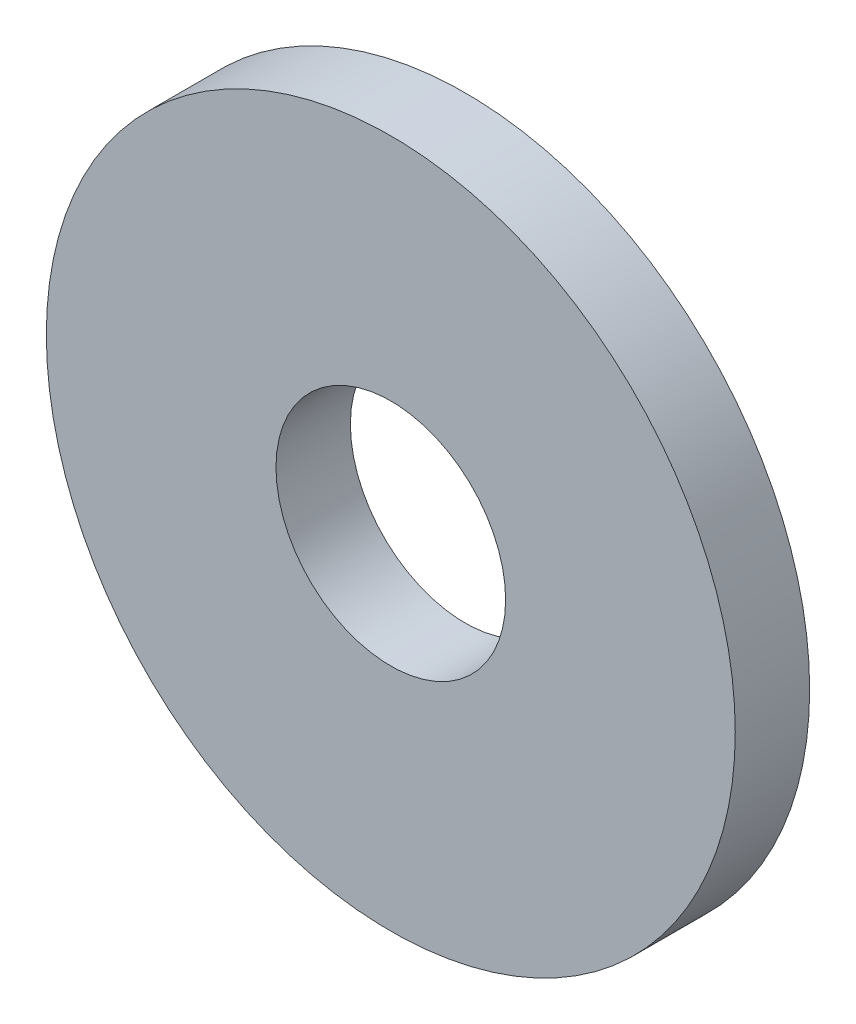
ISO-10303-21;
HEADER;
FILE_DESCRIPTION(('STEP AP214'),'2;1');
FILE_NAME('part.step','',(''),(''),'','','');
FILE_SCHEMA(('AUTOMOTIVE_DESIGN { 1 0 10303 214 1 1 1 1 }'));
ENDSEC;
DATA;
#1=APPLICATION_CONTEXT('core data for automotive mechanical design processes');
#2=APPLICATION_PROTOCOL_DEFINITION('international standard','automotive_design',2000,#1);
#3=PRODUCT_CONTEXT('',#1,'mechanical');
#4=PRODUCT('Part','Part','',(#3));
#5=PRODUCT_RELATED_PRODUCT_CATEGORY('part','',(#4));
#6=PRODUCT_DEFINITION_FORMATION('','',#4);
#7=PRODUCT_DEFINITION_CONTEXT('part definition',#1,'design');
#8=PRODUCT_DEFINITION('design','',#6,#7);
#9=PRODUCT_DEFINITION_SHAPE('','',#8);
#10=(LENGTH_UNIT() NAMED_UNIT(*) SI_UNIT(.MILLI.,.METRE.));
#11=(NAMED_UNIT(*) PLANE_ANGLE_UNIT() SI_UNIT($,.RADIAN.));
#12=(NAMED_UNIT(*) SI_UNIT($,.STERADIAN.) SOLID_ANGLE_UNIT());
#13=UNCERTAINTY_MEASURE_WITH_UNIT(LENGTH_MEASURE(1.E-05),#10,'distance_accuracy_value','');
#14=(GEOMETRIC_REPRESENTATION_CONTEXT(3) GLOBAL_UNCERTAINTY_ASSIGNED_CONTEXT((#13)) GLOBAL_UNIT_ASSIGNED_CONTEXT((#10,
#11,#12)) REPRESENTATION_CONTEXT('',''));
#15=CARTESIAN_POINT('',(0.,0.,0.));
#16=DIRECTION('',(0.,0.,1.));
#17=DIRECTION('',(1.,0.,0.));
#18=AXIS2_PLACEMENT_3D('',#15,#16,#17);
#19=CARTESIAN_POINT('',(0.,0.,0.51435));
#20=DIRECTION('',(0.,0.,1.));
#21=DIRECTION('',(1.,0.,0.));
#22=AXIS2_PLACEMENT_3D('',#19,#20,#21);
#23=PLANE('',#22);
#24=CARTESIAN_POINT('',(0.,0.,0.51435));
#25=DIRECTION('',(0.,0.,1.));
#26=DIRECTION('',(1.,0.,0.));
#27=AXIS2_PLACEMENT_3D('',#24,#25,#26);
#28=CIRCLE('',#27,4.7625);
#29=CARTESIAN_POINT('',(4.7625,0.,0.51435));
#30=VERTEX_POINT('',#29);
#31=EDGE_CURVE('E10',#30,#30,#28,.T.);
#32=ORIENTED_EDGE('',*,*,#31,.T.);
#33=EDGE_LOOP('',(#32));
#34=FACE_BOUND('',#33,.T.);
#35=CARTESIAN_POINT('',(0.,0.,0.51435));
#36=DIRECTION('',(0.,0.,1.));
#37=DIRECTION('',(1.,0.,0.));
#38=AXIS2_PLACEMENT_3D('',#35,#36,#37);
#39=CIRCLE('',#38,1.5875);
#40=CARTESIAN_POINT('',(1.5875,0.,0.51435));
#41=VERTEX_POINT('',#40);
#42=EDGE_CURVE('E57',#41,#41,#39,.T.);
#43=ORIENTED_EDGE('',*,*,#42,.F.);
#44=EDGE_LOOP('',(#43));
#45=FACE_BOUND('',#44,.T.);
#46=ADVANCED_FACE('F43',(#34,#45),#23,.T.);
#47=CARTESIAN_POINT('',(0.,0.,-0.51435));
#48=DIRECTION('',(0.,0.,1.));
#49=DIRECTION('',(1.,0.,0.));
#50=AXIS2_PLACEMENT_3D('',#47,#48,#49);
#51=PLANE('',#50);
#52=CARTESIAN_POINT('',(0.,0.,-0.51435));
#53=DIRECTION('',(0.,0.,1.));
#54=DIRECTION('',(1.,0.,0.));
#55=AXIS2_PLACEMENT_3D('',#52,#53,#54);
#56=CIRCLE('',#55,4.7625);
#57=CARTESIAN_POINT('',(4.7625,0.,-0.51435));
#58=VERTEX_POINT('',#57);
#59=EDGE_CURVE('E47',#58,#58,#56,.T.);
#60=ORIENTED_EDGE('',*,*,#59,.F.);
#61=EDGE_LOOP('',(#60));
#62=FACE_BOUND('',#61,.T.);
#63=CARTESIAN_POINT('',(0.,0.,-0.51435));
#64=DIRECTION('',(0.,0.,1.));
#65=DIRECTION('',(1.,0.,0.));
#66=AXIS2_PLACEMENT_3D('',#63,#64,#65);
#67=CIRCLE('',#66,1.5875);
#68=CARTESIAN_POINT('',(1.5875,0.,-0.51435));
#69=VERTEX_POINT('',#68);
#70=EDGE_CURVE('E59',#69,#69,#67,.T.);
#71=ORIENTED_EDGE('',*,*,#70,.T.);
#72=EDGE_LOOP('',(#71));
#73=FACE_BOUND('',#72,.T.);
#74=ADVANCED_FACE('F72',(#62,#73),#51,.F.);
#75=CARTESIAN_POINT('',(0.,0.,0.51435));
#76=DIRECTION('',(0.,0.,-1.));
#77=DIRECTION('',(-1.,0.,0.));
#78=AXIS2_PLACEMENT_3D('',#75,#76,#77);
#79=CYLINDRICAL_SURFACE('',#78,4.7625);
#80=ORIENTED_EDGE('',*,*,#31,.F.);
#81=EDGE_LOOP('',(#80));
#82=FACE_BOUND('',#81,.T.);
#83=ORIENTED_EDGE('',*,*,#59,.T.);
#84=EDGE_LOOP('',(#83));
#85=FACE_BOUND('',#84,.T.);
#86=ADVANCED_FACE('F45',(#82,#85),#79,.T.);
#87=CARTESIAN_POINT('',(0.,0.,0.51435));
#88=DIRECTION('',(0.,0.,-1.));
#89=DIRECTION('',(-1.,0.,0.));
#90=AXIS2_PLACEMENT_3D('',#87,#88,#89);
#91=CYLINDRICAL_SURFACE('',#90,1.5875);
#92=ORIENTED_EDGE('',*,*,#42,.T.);
#93=EDGE_LOOP('',(#92));
#94=FACE_BOUND('',#93,.T.);
#95=ORIENTED_EDGE('',*,*,#70,.F.);
#96=EDGE_LOOP('',(#95));
#97=FACE_BOUND('',#96,.T.);
#98=ADVANCED_FACE('F68',(#94,#97),#91,.F.);
#99=CLOSED_SHELL('',(#46,#74,#86,#98));
#100=MANIFOLD_SOLID_BREP('B2',#99);
#101=ADVANCED_BREP_SHAPE_REPRESENTATION('',(#18,#100),#14);
#102=SHAPE_DEFINITION_REPRESENTATION(#9,#101);
ENDSEC;
END-ISO-10303-21;
